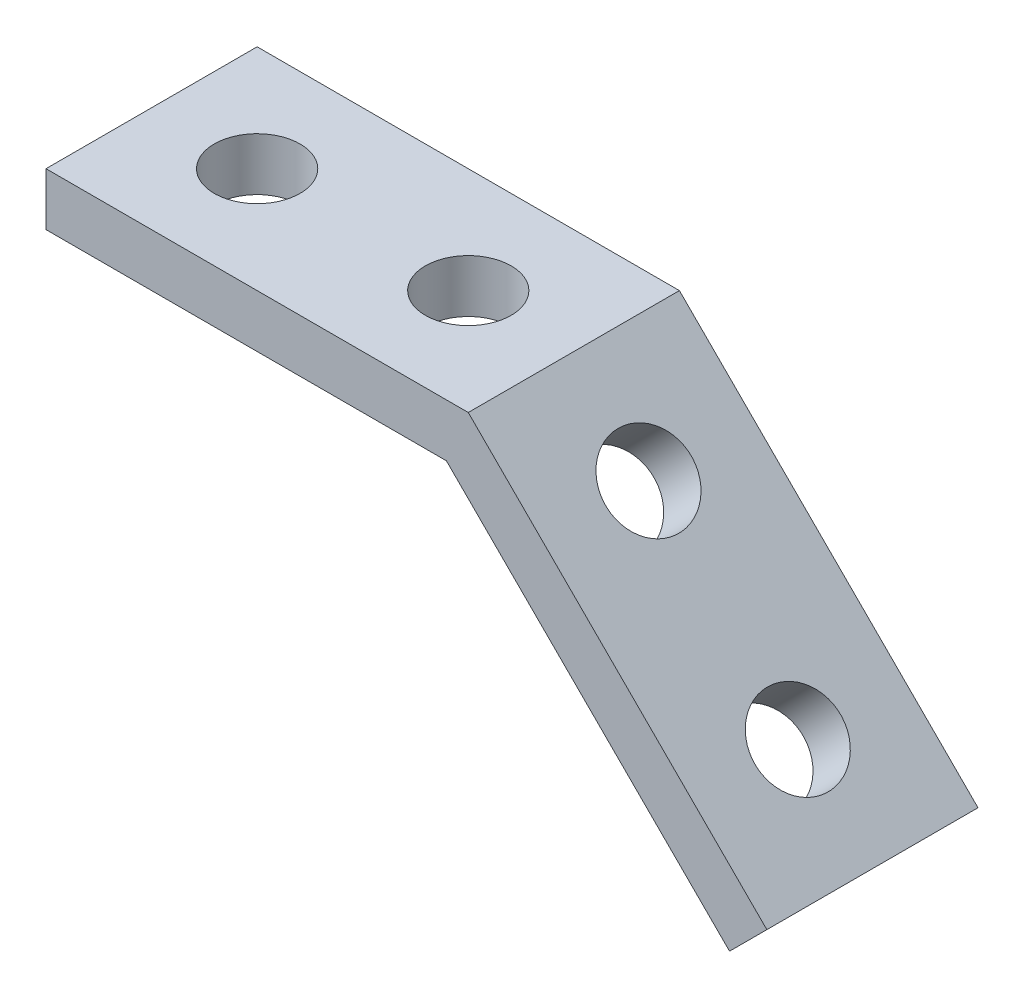
ISO-10303-21;
HEADER;
FILE_DESCRIPTION(('STEP AP214'),'2;1');
FILE_NAME('part.step','',(''),(''),'','','');
FILE_SCHEMA(('AUTOMOTIVE_DESIGN { 1 0 10303 214 1 1 1 1 }'));
ENDSEC;
DATA;
#1=APPLICATION_CONTEXT('core data for automotive mechanical design processes');
#2=APPLICATION_PROTOCOL_DEFINITION('international standard','automotive_design',2000,#1);
#3=PRODUCT_CONTEXT('',#1,'mechanical');
#4=PRODUCT('Part','Part','',(#3));
#5=PRODUCT_RELATED_PRODUCT_CATEGORY('part','',(#4));
#6=PRODUCT_DEFINITION_FORMATION('','',#4);
#7=PRODUCT_DEFINITION_CONTEXT('part definition',#1,'design');
#8=PRODUCT_DEFINITION('design','',#6,#7);
#9=PRODUCT_DEFINITION_SHAPE('','',#8);
#10=(LENGTH_UNIT() NAMED_UNIT(*) SI_UNIT(.MILLI.,.METRE.));
#11=(NAMED_UNIT(*) PLANE_ANGLE_UNIT() SI_UNIT($,.RADIAN.));
#12=(NAMED_UNIT(*) SI_UNIT($,.STERADIAN.) SOLID_ANGLE_UNIT());
#13=UNCERTAINTY_MEASURE_WITH_UNIT(LENGTH_MEASURE(1.E-05),#10,'distance_accuracy_value','');
#14=(GEOMETRIC_REPRESENTATION_CONTEXT(3) GLOBAL_UNCERTAINTY_ASSIGNED_CONTEXT((#13)) GLOBAL_UNIT_ASSIGNED_CONTEXT((#10,
#11,#12)) REPRESENTATION_CONTEXT('',''));
#15=CARTESIAN_POINT('',(0.,0.,0.));
#16=DIRECTION('',(0.,0.,1.));
#17=DIRECTION('',(1.,0.,0.));
#18=AXIS2_PLACEMENT_3D('',#15,#16,#17);
#19=CARTESIAN_POINT('',(-102.370082778447,40.824509732116,12.7));
#20=DIRECTION('',(1.,0.,0.));
#21=DIRECTION('',(0.,1.,0.));
#22=AXIS2_PLACEMENT_3D('',#19,#20,#21);
#23=PLANE('',#22);
#24=DIRECTION('',(0.,-1.,0.));
#25=VECTOR('',#24,1.);
#26=CARTESIAN_POINT('',(-102.370082778447,40.824509732116,0.));
#27=LINE('',#26,#25);
#28=CARTESIAN_POINT('',(-102.370082778447,43.999509732116,0.));
#29=VERTEX_POINT('',#28);
#30=CARTESIAN_POINT('',(-102.370082778447,40.824509732116,0.));
#31=VERTEX_POINT('',#30);
#32=EDGE_CURVE('E128',#29,#31,#27,.T.);
#33=ORIENTED_EDGE('',*,*,#32,.T.);
#34=DIRECTION('',(0.,0.,-1.));
#35=VECTOR('',#34,1.);
#36=CARTESIAN_POINT('',(-102.370082778447,40.824509732116,12.7));
#37=LINE('',#36,#35);
#38=CARTESIAN_POINT('',(-102.370082778447,40.824509732116,12.7));
#39=VERTEX_POINT('',#38);
#40=EDGE_CURVE('E11',#39,#31,#37,.T.);
#41=ORIENTED_EDGE('',*,*,#40,.F.);
#42=DIRECTION('',(0.,-1.,0.));
#43=VECTOR('',#42,1.);
#44=CARTESIAN_POINT('',(-102.370082778447,40.824509732116,12.7));
#45=LINE('',#44,#43);
#46=CARTESIAN_POINT('',(-102.370082778447,43.999509732116,12.7));
#47=VERTEX_POINT('',#46);
#48=EDGE_CURVE('E145',#47,#39,#45,.T.);
#49=ORIENTED_EDGE('',*,*,#48,.F.);
#50=DIRECTION('',(0.,0.,-1.));
#51=VECTOR('',#50,1.);
#52=CARTESIAN_POINT('',(-102.370082778447,43.999509732116,12.7));
#53=LINE('',#52,#51);
#54=EDGE_CURVE('E124',#47,#29,#53,.T.);
#55=ORIENTED_EDGE('',*,*,#54,.T.);
#56=EDGE_LOOP('',(#33,#41,#49,#55));
#57=FACE_BOUND('',#56,.T.);
#58=ADVANCED_FACE('F39',(#57),#23,.F.);
#59=CARTESIAN_POINT('',(-78.285210838982,40.824509732116,12.7));
#60=DIRECTION('',(0.,1.,0.));
#61=DIRECTION('',(0.,0.,1.));
#62=AXIS2_PLACEMENT_3D('',#59,#60,#61);
#63=PLANE('',#62);
#64=CARTESIAN_POINT('',(-96.0200827784474,40.824509732116,6.35));
#65=DIRECTION('',(0.,1.,0.));
#66=DIRECTION('',(0.,0.,1.));
#67=AXIS2_PLACEMENT_3D('',#64,#65,#66);
#68=CIRCLE('',#67,2.5796875);
#69=CARTESIAN_POINT('',(-96.0200827784474,40.824509732116,8.9296875));
#70=VERTEX_POINT('',#69);
#71=EDGE_CURVE('E133',#70,#70,#68,.T.);
#72=ORIENTED_EDGE('',*,*,#71,.T.);
#73=EDGE_LOOP('',(#72));
#74=FACE_BOUND('',#73,.T.);
#75=CARTESIAN_POINT('',(-83.3200827784474,40.824509732116,6.35));
#76=DIRECTION('',(0.,1.,0.));
#77=DIRECTION('',(0.,0.,1.));
#78=AXIS2_PLACEMENT_3D('',#75,#76,#77);
#79=CIRCLE('',#78,2.5796875);
#80=CARTESIAN_POINT('',(-83.3200827784474,40.824509732116,8.9296875));
#81=VERTEX_POINT('',#80);
#82=EDGE_CURVE('E282',#81,#81,#79,.T.);
#83=ORIENTED_EDGE('',*,*,#82,.T.);
#84=EDGE_LOOP('',(#83));
#85=FACE_BOUND('',#84,.T.);
#86=DIRECTION('',(1.,0.,0.));
#87=VECTOR('',#86,1.);
#88=CARTESIAN_POINT('',(-78.285210838982,40.824509732116,0.));
#89=LINE('',#88,#87);
#90=CARTESIAN_POINT('',(-78.285210838982,40.824509732116,0.));
#91=VERTEX_POINT('',#90);
#92=EDGE_CURVE('E132',#31,#91,#89,.T.);
#93=ORIENTED_EDGE('',*,*,#92,.T.);
#94=DIRECTION('',(0.,0.,-1.));
#95=VECTOR('',#94,1.);
#96=CARTESIAN_POINT('',(-78.285210838982,40.824509732116,12.7));
#97=LINE('',#96,#95);
#98=CARTESIAN_POINT('',(-78.285210838982,40.824509732116,12.7));
#99=VERTEX_POINT('',#98);
#100=EDGE_CURVE('E48',#99,#91,#97,.T.);
#101=ORIENTED_EDGE('',*,*,#100,.F.);
#102=DIRECTION('',(1.,0.,0.));
#103=VECTOR('',#102,1.);
#104=CARTESIAN_POINT('',(-78.285210838982,40.824509732116,12.7));
#105=LINE('',#104,#103);
#106=EDGE_CURVE('E93',#39,#99,#105,.T.);
#107=ORIENTED_EDGE('',*,*,#106,.F.);
#108=ORIENTED_EDGE('',*,*,#40,.T.);
#109=EDGE_LOOP('',(#93,#101,#107,#108));
#110=FACE_BOUND('',#109,.T.);
#111=ADVANCED_FACE('F177',(#74,#85,#110),#63,.F.);
#112=CARTESIAN_POINT('',(-61.2546345665765,23.7939334597103,12.7));
#113=DIRECTION('',(0.707106781186552,0.707106781186543,0.));
#114=DIRECTION('',(-0.707106781186543,0.707106781186552,0.));
#115=AXIS2_PLACEMENT_3D('',#112,#113,#114);
#116=PLANE('',#115);
#117=CARTESIAN_POINT('',(-74.7250187481801,37.2643176413142,6.35));
#118=DIRECTION('',(0.707106781186552,0.707106781186543,0.));
#119=DIRECTION('',(-0.707106781186543,0.707106781186552,0.));
#120=AXIS2_PLACEMENT_3D('',#117,#118,#119);
#121=CIRCLE('',#120,2.5796875);
#122=CARTESIAN_POINT('',(-76.5491332727723,39.0884321659063,6.35));
#123=VERTEX_POINT('',#122);
#124=EDGE_CURVE('E298',#123,#123,#121,.T.);
#125=ORIENTED_EDGE('',*,*,#124,.T.);
#126=EDGE_LOOP('',(#125));
#127=FACE_BOUND('',#126,.T.);
#128=CARTESIAN_POINT('',(-65.744762627111,28.284061520245,6.35));
#129=DIRECTION('',(0.707106781186552,0.707106781186543,0.));
#130=DIRECTION('',(-0.707106781186543,0.707106781186552,0.));
#131=AXIS2_PLACEMENT_3D('',#128,#129,#130);
#132=CIRCLE('',#131,2.5796875);
#133=CARTESIAN_POINT('',(-67.5688771517032,30.1081760448371,6.35));
#134=VERTEX_POINT('',#133);
#135=EDGE_CURVE('E303',#134,#134,#132,.T.);
#136=ORIENTED_EDGE('',*,*,#135,.T.);
#137=EDGE_LOOP('',(#136));
#138=FACE_BOUND('',#137,.T.);
#139=DIRECTION('',(0.707106781186543,-0.707106781186552,0.));
#140=VECTOR('',#139,1.);
#141=CARTESIAN_POINT('',(-61.2546345665765,23.7939334597103,0.));
#142=LINE('',#141,#140);
#143=CARTESIAN_POINT('',(-61.2546345665765,23.7939334597103,0.));
#144=VERTEX_POINT('',#143);
#145=EDGE_CURVE('E136',#91,#144,#142,.T.);
#146=ORIENTED_EDGE('',*,*,#145,.T.);
#147=DIRECTION('',(0.,0.,-1.));
#148=VECTOR('',#147,1.);
#149=CARTESIAN_POINT('',(-61.2546345665765,23.7939334597103,12.7));
#150=LINE('',#149,#148);
#151=CARTESIAN_POINT('',(-61.2546345665765,23.7939334597103,12.7));
#152=VERTEX_POINT('',#151);
#153=EDGE_CURVE('E117',#152,#144,#150,.T.);
#154=ORIENTED_EDGE('',*,*,#153,.F.);
#155=DIRECTION('',(0.707106781186543,-0.707106781186552,0.));
#156=VECTOR('',#155,1.);
#157=CARTESIAN_POINT('',(-61.2546345665765,23.7939334597103,12.7));
#158=LINE('',#157,#156);
#159=EDGE_CURVE('E106',#99,#152,#158,.T.);
#160=ORIENTED_EDGE('',*,*,#159,.F.);
#161=ORIENTED_EDGE('',*,*,#100,.T.);
#162=EDGE_LOOP('',(#146,#154,#160,#161));
#163=FACE_BOUND('',#162,.T.);
#164=ADVANCED_FACE('F155',(#127,#138,#163),#116,.F.);
#165=CARTESIAN_POINT('',(-59.0095705363092,26.0389974899776,12.7));
#166=DIRECTION('',(-0.707106781186542,0.707106781186554,0.));
#167=DIRECTION('',(-0.707106781186554,-0.707106781186542,0.));
#168=AXIS2_PLACEMENT_3D('',#165,#166,#167);
#169=PLANE('',#168);
#170=DIRECTION('',(0.707106781186554,0.707106781186542,0.));
#171=VECTOR('',#170,1.);
#172=CARTESIAN_POINT('',(-59.0095705363092,26.0389974899776,0.));
#173=LINE('',#172,#171);
#174=CARTESIAN_POINT('',(-59.0095705363092,26.0389974899776,0.));
#175=VERTEX_POINT('',#174);
#176=EDGE_CURVE('E115',#144,#175,#173,.T.);
#177=ORIENTED_EDGE('',*,*,#176,.T.);
#178=DIRECTION('',(0.,0.,-1.));
#179=VECTOR('',#178,1.);
#180=CARTESIAN_POINT('',(-59.0095705363092,26.0389974899776,12.7));
#181=LINE('',#180,#179);
#182=CARTESIAN_POINT('',(-59.0095705363092,26.0389974899776,12.7));
#183=VERTEX_POINT('',#182);
#184=EDGE_CURVE('E112',#183,#175,#181,.T.);
#185=ORIENTED_EDGE('',*,*,#184,.F.);
#186=DIRECTION('',(0.707106781186554,0.707106781186542,0.));
#187=VECTOR('',#186,1.);
#188=CARTESIAN_POINT('',(-59.0095705363092,26.0389974899776,12.7));
#189=LINE('',#188,#187);
#190=EDGE_CURVE('E100',#152,#183,#189,.T.);
#191=ORIENTED_EDGE('',*,*,#190,.F.);
#192=ORIENTED_EDGE('',*,*,#153,.T.);
#193=EDGE_LOOP('',(#177,#185,#191,#192));
#194=FACE_BOUND('',#193,.T.);
#195=ADVANCED_FACE('F113',(#194),#169,.F.);
#196=CARTESIAN_POINT('',(-76.9700827784474,43.999509732116,12.7));
#197=DIRECTION('',(-0.707106781186552,-0.707106781186543,0.));
#198=DIRECTION('',(0.707106781186543,-0.707106781186552,0.));
#199=AXIS2_PLACEMENT_3D('',#196,#197,#198);
#200=PLANE('',#199);
#201=CARTESIAN_POINT('',(-72.4799547179128,39.5093816715814,6.35));
#202=DIRECTION('',(0.707106781186552,0.707106781186543,0.));
#203=DIRECTION('',(-0.707106781186543,0.707106781186552,0.));
#204=AXIS2_PLACEMENT_3D('',#201,#202,#203);
#205=CIRCLE('',#204,2.5796875);
#206=CARTESIAN_POINT('',(-74.304069242505,41.3334961961736,6.35));
#207=VERTEX_POINT('',#206);
#208=EDGE_CURVE('E311',#207,#207,#205,.T.);
#209=ORIENTED_EDGE('',*,*,#208,.F.);
#210=EDGE_LOOP('',(#209));
#211=FACE_BOUND('',#210,.T.);
#212=CARTESIAN_POINT('',(-63.4996985968437,30.5291255505122,6.35));
#213=DIRECTION('',(0.707106781186552,0.707106781186543,0.));
#214=DIRECTION('',(-0.707106781186543,0.707106781186552,0.));
#215=AXIS2_PLACEMENT_3D('',#212,#213,#214);
#216=CIRCLE('',#215,2.5796875);
#217=CARTESIAN_POINT('',(-65.3238131214359,32.3532400751044,6.35));
#218=VERTEX_POINT('',#217);
#219=EDGE_CURVE('E307',#218,#218,#216,.T.);
#220=ORIENTED_EDGE('',*,*,#219,.F.);
#221=EDGE_LOOP('',(#220));
#222=FACE_BOUND('',#221,.T.);
#223=DIRECTION('',(-0.707106781186543,0.707106781186552,0.));
#224=VECTOR('',#223,1.);
#225=CARTESIAN_POINT('',(-76.9700827784474,43.999509732116,0.));
#226=LINE('',#225,#224);
#227=CARTESIAN_POINT('',(-76.9700827784474,43.999509732116,0.));
#228=VERTEX_POINT('',#227);
#229=EDGE_CURVE('E79',#175,#228,#226,.T.);
#230=ORIENTED_EDGE('',*,*,#229,.T.);
#231=DIRECTION('',(0.,0.,-1.));
#232=VECTOR('',#231,1.);
#233=CARTESIAN_POINT('',(-76.9700827784474,43.999509732116,12.7));
#234=LINE('',#233,#232);
#235=CARTESIAN_POINT('',(-76.9700827784474,43.999509732116,12.7));
#236=VERTEX_POINT('',#235);
#237=EDGE_CURVE('E118',#236,#228,#234,.T.);
#238=ORIENTED_EDGE('',*,*,#237,.F.);
#239=DIRECTION('',(-0.707106781186543,0.707106781186552,0.));
#240=VECTOR('',#239,1.);
#241=CARTESIAN_POINT('',(-76.9700827784474,43.999509732116,12.7));
#242=LINE('',#241,#240);
#243=EDGE_CURVE('E104',#183,#236,#242,.T.);
#244=ORIENTED_EDGE('',*,*,#243,.F.);
#245=ORIENTED_EDGE('',*,*,#184,.T.);
#246=EDGE_LOOP('',(#230,#238,#244,#245));
#247=FACE_BOUND('',#246,.T.);
#248=ADVANCED_FACE('F120',(#211,#222,#247),#200,.F.);
#249=CARTESIAN_POINT('',(-102.370082778447,43.999509732116,12.7));
#250=DIRECTION('',(0.,-1.,0.));
#251=DIRECTION('',(1.,0.,0.));
#252=AXIS2_PLACEMENT_3D('',#249,#250,#251);
#253=PLANE('',#252);
#254=CARTESIAN_POINT('',(-96.0200827784474,43.999509732116,6.35));
#255=DIRECTION('',(0.,1.,0.));
#256=DIRECTION('',(-1.,0.,0.));
#257=AXIS2_PLACEMENT_3D('',#254,#255,#256);
#258=CIRCLE('',#257,2.5796875);
#259=CARTESIAN_POINT('',(-98.5997702784474,43.999509732116,6.35));
#260=VERTEX_POINT('',#259);
#261=EDGE_CURVE('E284',#260,#260,#258,.T.);
#262=ORIENTED_EDGE('',*,*,#261,.F.);
#263=EDGE_LOOP('',(#262));
#264=FACE_BOUND('',#263,.T.);
#265=CARTESIAN_POINT('',(-83.3200827784474,43.999509732116,6.35));
#266=DIRECTION('',(0.,1.,0.));
#267=DIRECTION('',(-1.,0.,0.));
#268=AXIS2_PLACEMENT_3D('',#265,#266,#267);
#269=CIRCLE('',#268,2.5796875);
#270=CARTESIAN_POINT('',(-85.8997702784474,43.999509732116,6.35));
#271=VERTEX_POINT('',#270);
#272=EDGE_CURVE('E279',#271,#271,#269,.T.);
#273=ORIENTED_EDGE('',*,*,#272,.F.);
#274=EDGE_LOOP('',(#273));
#275=FACE_BOUND('',#274,.T.);
#276=DIRECTION('',(-1.,0.,0.));
#277=VECTOR('',#276,1.);
#278=CARTESIAN_POINT('',(-102.370082778447,43.999509732116,0.));
#279=LINE('',#278,#277);
#280=EDGE_CURVE('E85',#228,#29,#279,.T.);
#281=ORIENTED_EDGE('',*,*,#280,.T.);
#282=ORIENTED_EDGE('',*,*,#54,.F.);
#283=DIRECTION('',(-1.,0.,0.));
#284=VECTOR('',#283,1.);
#285=CARTESIAN_POINT('',(-102.370082778447,43.999509732116,12.7));
#286=LINE('',#285,#284);
#287=EDGE_CURVE('E56',#236,#47,#286,.T.);
#288=ORIENTED_EDGE('',*,*,#287,.F.);
#289=ORIENTED_EDGE('',*,*,#237,.T.);
#290=EDGE_LOOP('',(#281,#282,#288,#289));
#291=FACE_BOUND('',#290,.T.);
#292=ADVANCED_FACE('F162',(#264,#275,#291),#253,.F.);
#293=CARTESIAN_POINT('',(0.,0.,12.7));
#294=DIRECTION('',(0.,0.,-1.));
#295=DIRECTION('',(-1.,0.,0.));
#296=AXIS2_PLACEMENT_3D('',#293,#294,#295);
#297=PLANE('',#296);
#298=ORIENTED_EDGE('',*,*,#48,.T.);
#299=ORIENTED_EDGE('',*,*,#106,.T.);
#300=ORIENTED_EDGE('',*,*,#159,.T.);
#301=ORIENTED_EDGE('',*,*,#190,.T.);
#302=ORIENTED_EDGE('',*,*,#243,.T.);
#303=ORIENTED_EDGE('',*,*,#287,.T.);
#304=EDGE_LOOP('',(#298,#299,#300,#301,#302,#303));
#305=FACE_BOUND('',#304,.T.);
#306=ADVANCED_FACE('F102',(#305),#297,.F.);
#307=CARTESIAN_POINT('',(0.,0.,0.));
#308=DIRECTION('',(0.,0.,-1.));
#309=DIRECTION('',(-1.,0.,0.));
#310=AXIS2_PLACEMENT_3D('',#307,#308,#309);
#311=PLANE('',#310);
#312=ORIENTED_EDGE('',*,*,#32,.F.);
#313=ORIENTED_EDGE('',*,*,#280,.F.);
#314=ORIENTED_EDGE('',*,*,#229,.F.);
#315=ORIENTED_EDGE('',*,*,#176,.F.);
#316=ORIENTED_EDGE('',*,*,#145,.F.);
#317=ORIENTED_EDGE('',*,*,#92,.F.);
#318=EDGE_LOOP('',(#312,#313,#314,#315,#316,#317));
#319=FACE_BOUND('',#318,.T.);
#320=ADVANCED_FACE('F158',(#319),#311,.T.);
#321=CARTESIAN_POINT('',(-83.3200827784474,31.299509732116,6.35));
#322=DIRECTION('',(0.,1.,0.));
#323=DIRECTION('',(-1.,0.,0.));
#324=AXIS2_PLACEMENT_3D('',#321,#322,#323);
#325=CYLINDRICAL_SURFACE('',#324,2.5796875);
#326=ORIENTED_EDGE('',*,*,#272,.T.);
#327=EDGE_LOOP('',(#326));
#328=FACE_BOUND('',#327,.T.);
#329=ORIENTED_EDGE('',*,*,#82,.F.);
#330=EDGE_LOOP('',(#329));
#331=FACE_BOUND('',#330,.T.);
#332=ADVANCED_FACE('F235',(#328,#331),#325,.F.);
#333=CARTESIAN_POINT('',(-96.0200827784474,31.2995097321161,6.35));
#334=DIRECTION('',(0.,1.,0.));
#335=DIRECTION('',(-1.,0.,0.));
#336=AXIS2_PLACEMENT_3D('',#333,#334,#335);
#337=CYLINDRICAL_SURFACE('',#336,2.5796875);
#338=ORIENTED_EDGE('',*,*,#261,.T.);
#339=EDGE_LOOP('',(#338));
#340=FACE_BOUND('',#339,.T.);
#341=ORIENTED_EDGE('',*,*,#71,.F.);
#342=EDGE_LOOP('',(#341));
#343=FACE_BOUND('',#342,.T.);
#344=ADVANCED_FACE('F215',(#340,#343),#337,.F.);
#345=CARTESIAN_POINT('',(-72.4799547179129,21.5488694294431,6.35));
#346=DIRECTION('',(0.707106781186552,0.707106781186543,0.));
#347=DIRECTION('',(-0.707106781186543,0.707106781186552,0.));
#348=AXIS2_PLACEMENT_3D('',#345,#346,#347);
#349=CYLINDRICAL_SURFACE('',#348,2.5796875);
#350=ORIENTED_EDGE('',*,*,#219,.T.);
#351=EDGE_LOOP('',(#350));
#352=FACE_BOUND('',#351,.T.);
#353=ORIENTED_EDGE('',*,*,#135,.F.);
#354=EDGE_LOOP('',(#353));
#355=FACE_BOUND('',#354,.T.);
#356=ADVANCED_FACE('F209',(#352,#355),#349,.F.);
#357=CARTESIAN_POINT('',(-81.460210838982,30.5291255505123,6.35));
#358=DIRECTION('',(0.707106781186552,0.707106781186543,0.));
#359=DIRECTION('',(-0.707106781186543,0.707106781186552,0.));
#360=AXIS2_PLACEMENT_3D('',#357,#358,#359);
#361=CYLINDRICAL_SURFACE('',#360,2.5796875);
#362=ORIENTED_EDGE('',*,*,#208,.T.);
#363=EDGE_LOOP('',(#362));
#364=FACE_BOUND('',#363,.T.);
#365=ORIENTED_EDGE('',*,*,#124,.F.);
#366=EDGE_LOOP('',(#365));
#367=FACE_BOUND('',#366,.T.);
#368=ADVANCED_FACE('F214',(#364,#367),#361,.F.);
#369=CLOSED_SHELL('',(#58,#111,#164,#195,#248,#292,#306,#320,#332,#344,#356,#368));
#370=MANIFOLD_SOLID_BREP('B2',#369);
#371=ADVANCED_BREP_SHAPE_REPRESENTATION('',(#18,#370),#14);
#372=SHAPE_DEFINITION_REPRESENTATION(#9,#371);
ENDSEC;
END-ISO-10303-21;
